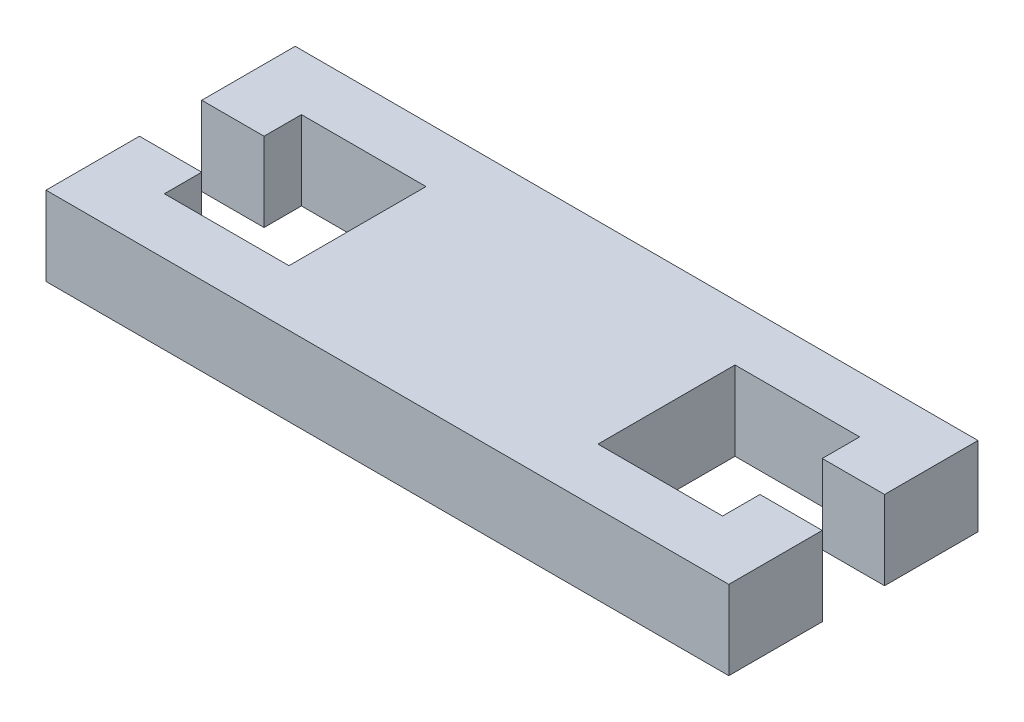
ISO-10303-21;
HEADER;
FILE_DESCRIPTION(('STEP AP214'),'2;1');
FILE_NAME('part.step','',(''),(''),'','','');
FILE_SCHEMA(('AUTOMOTIVE_DESIGN { 1 0 10303 214 1 1 1 1 }'));
ENDSEC;
DATA;
#1=APPLICATION_CONTEXT('core data for automotive mechanical design processes');
#2=APPLICATION_PROTOCOL_DEFINITION('international standard','automotive_design',2000,#1);
#3=PRODUCT_CONTEXT('',#1,'mechanical');
#4=PRODUCT('Part','Part','',(#3));
#5=PRODUCT_RELATED_PRODUCT_CATEGORY('part','',(#4));
#6=PRODUCT_DEFINITION_FORMATION('','',#4);
#7=PRODUCT_DEFINITION_CONTEXT('part definition',#1,'design');
#8=PRODUCT_DEFINITION('design','',#6,#7);
#9=PRODUCT_DEFINITION_SHAPE('','',#8);
#10=(LENGTH_UNIT() NAMED_UNIT(*) SI_UNIT(.MILLI.,.METRE.));
#11=(NAMED_UNIT(*) PLANE_ANGLE_UNIT() SI_UNIT($,.RADIAN.));
#12=(NAMED_UNIT(*) SI_UNIT($,.STERADIAN.) SOLID_ANGLE_UNIT());
#13=UNCERTAINTY_MEASURE_WITH_UNIT(LENGTH_MEASURE(1.E-05),#10,'distance_accuracy_value','');
#14=(GEOMETRIC_REPRESENTATION_CONTEXT(3) GLOBAL_UNCERTAINTY_ASSIGNED_CONTEXT((#13)) GLOBAL_UNIT_ASSIGNED_CONTEXT((#10,
#11,#12)) REPRESENTATION_CONTEXT('',''));
#15=CARTESIAN_POINT('',(0.,0.,0.));
#16=DIRECTION('',(0.,0.,1.));
#17=DIRECTION('',(1.,0.,0.));
#18=AXIS2_PLACEMENT_3D('',#15,#16,#17);
#19=CARTESIAN_POINT('',(0.,6.35,0.));
#20=DIRECTION('',(1.,0.,0.));
#21=DIRECTION('',(0.,0.,-1.));
#22=AXIS2_PLACEMENT_3D('',#19,#20,#21);
#23=PLANE('',#22);
#24=DIRECTION('',(0.,0.,1.));
#25=VECTOR('',#24,1.);
#26=CARTESIAN_POINT('',(0.,0.,0.));
#27=LINE('',#26,#25);
#28=CARTESIAN_POINT('',(0.,0.,-7.5));
#29=VERTEX_POINT('',#28);
#30=CARTESIAN_POINT('',(0.,0.,0.));
#31=VERTEX_POINT('',#30);
#32=EDGE_CURVE('E200',#29,#31,#27,.T.);
#33=ORIENTED_EDGE('',*,*,#32,.T.);
#34=DIRECTION('',(0.,-1.,0.));
#35=VECTOR('',#34,1.);
#36=CARTESIAN_POINT('',(0.,6.35,0.));
#37=LINE('',#36,#35);
#38=CARTESIAN_POINT('',(0.,6.35,0.));
#39=VERTEX_POINT('',#38);
#40=EDGE_CURVE('E11',#39,#31,#37,.T.);
#41=ORIENTED_EDGE('',*,*,#40,.F.);
#42=DIRECTION('',(0.,0.,1.));
#43=VECTOR('',#42,1.);
#44=CARTESIAN_POINT('',(0.,6.35,0.));
#45=LINE('',#44,#43);
#46=CARTESIAN_POINT('',(0.,6.35,-7.5));
#47=VERTEX_POINT('',#46);
#48=EDGE_CURVE('E238',#47,#39,#45,.T.);
#49=ORIENTED_EDGE('',*,*,#48,.F.);
#50=DIRECTION('',(0.,-1.,0.));
#51=VECTOR('',#50,1.);
#52=CARTESIAN_POINT('',(0.,6.35,-7.5));
#53=LINE('',#52,#51);
#54=EDGE_CURVE('E196',#47,#29,#53,.T.);
#55=ORIENTED_EDGE('',*,*,#54,.T.);
#56=EDGE_LOOP('',(#33,#41,#49,#55));
#57=FACE_BOUND('',#56,.T.);
#58=ADVANCED_FACE('F32',(#57),#23,.F.);
#59=CARTESIAN_POINT('',(0.,6.35,0.));
#60=DIRECTION('',(0.,0.,-1.));
#61=DIRECTION('',(-1.,0.,0.));
#62=AXIS2_PLACEMENT_3D('',#59,#60,#61);
#63=PLANE('',#62);
#64=DIRECTION('',(1.,0.,0.));
#65=VECTOR('',#64,1.);
#66=CARTESIAN_POINT('',(0.,0.,0.));
#67=LINE('',#66,#65);
#68=CARTESIAN_POINT('',(54.8,0.,0.));
#69=VERTEX_POINT('',#68);
#70=EDGE_CURVE('E203',#31,#69,#67,.T.);
#71=ORIENTED_EDGE('',*,*,#70,.T.);
#72=DIRECTION('',(0.,-1.,0.));
#73=VECTOR('',#72,1.);
#74=CARTESIAN_POINT('',(54.8,6.35,0.));
#75=LINE('',#74,#73);
#76=CARTESIAN_POINT('',(54.8,6.35,0.));
#77=VERTEX_POINT('',#76);
#78=EDGE_CURVE('E40',#77,#69,#75,.T.);
#79=ORIENTED_EDGE('',*,*,#78,.F.);
#80=DIRECTION('',(1.,0.,0.));
#81=VECTOR('',#80,1.);
#82=CARTESIAN_POINT('',(0.,6.35,0.));
#83=LINE('',#82,#81);
#84=EDGE_CURVE('E127',#39,#77,#83,.T.);
#85=ORIENTED_EDGE('',*,*,#84,.F.);
#86=ORIENTED_EDGE('',*,*,#40,.T.);
#87=EDGE_LOOP('',(#71,#79,#85,#86));
#88=FACE_BOUND('',#87,.T.);
#89=ADVANCED_FACE('F356',(#88),#63,.F.);
#90=CARTESIAN_POINT('',(54.8,6.35,0.));
#91=DIRECTION('',(-1.,0.,0.));
#92=DIRECTION('',(0.,0.,1.));
#93=AXIS2_PLACEMENT_3D('',#90,#91,#92);
#94=PLANE('',#93);
#95=DIRECTION('',(0.,0.,-1.));
#96=VECTOR('',#95,1.);
#97=CARTESIAN_POINT('',(54.8,0.,0.));
#98=LINE('',#97,#96);
#99=CARTESIAN_POINT('',(54.8,0.,-7.5));
#100=VERTEX_POINT('',#99);
#101=EDGE_CURVE('E205',#69,#100,#98,.T.);
#102=ORIENTED_EDGE('',*,*,#101,.T.);
#103=DIRECTION('',(0.,-1.,0.));
#104=VECTOR('',#103,1.);
#105=CARTESIAN_POINT('',(54.8,6.35,-7.5));
#106=LINE('',#105,#104);
#107=CARTESIAN_POINT('',(54.8,6.35,-7.5));
#108=VERTEX_POINT('',#107);
#109=EDGE_CURVE('E281',#108,#100,#106,.T.);
#110=ORIENTED_EDGE('',*,*,#109,.F.);
#111=DIRECTION('',(0.,0.,-1.));
#112=VECTOR('',#111,1.);
#113=CARTESIAN_POINT('',(54.8,6.35,0.));
#114=LINE('',#113,#112);
#115=EDGE_CURVE('E289',#77,#108,#114,.T.);
#116=ORIENTED_EDGE('',*,*,#115,.F.);
#117=ORIENTED_EDGE('',*,*,#78,.T.);
#118=EDGE_LOOP('',(#102,#110,#116,#117));
#119=FACE_BOUND('',#118,.T.);
#120=ADVANCED_FACE('F287',(#119),#94,.F.);
#121=CARTESIAN_POINT('',(54.8,6.35,-7.5));
#122=DIRECTION('',(0.,0.,1.));
#123=DIRECTION('',(1.,0.,0.));
#124=AXIS2_PLACEMENT_3D('',#121,#122,#123);
#125=PLANE('',#124);
#126=DIRECTION('',(-1.,0.,0.));
#127=VECTOR('',#126,1.);
#128=CARTESIAN_POINT('',(54.8,0.,-7.5));
#129=LINE('',#128,#127);
#130=CARTESIAN_POINT('',(49.8,0.,-7.5));
#131=VERTEX_POINT('',#130);
#132=EDGE_CURVE('E207',#100,#131,#129,.T.);
#133=ORIENTED_EDGE('',*,*,#132,.T.);
#134=DIRECTION('',(0.,-1.,0.));
#135=VECTOR('',#134,1.);
#136=CARTESIAN_POINT('',(49.8,6.35,-7.5));
#137=LINE('',#136,#135);
#138=CARTESIAN_POINT('',(49.8,6.35,-7.5));
#139=VERTEX_POINT('',#138);
#140=EDGE_CURVE('E278',#139,#131,#137,.T.);
#141=ORIENTED_EDGE('',*,*,#140,.F.);
#142=DIRECTION('',(-1.,0.,0.));
#143=VECTOR('',#142,1.);
#144=CARTESIAN_POINT('',(54.8,6.35,-7.5));
#145=LINE('',#144,#143);
#146=EDGE_CURVE('E307',#108,#139,#145,.T.);
#147=ORIENTED_EDGE('',*,*,#146,.F.);
#148=ORIENTED_EDGE('',*,*,#109,.T.);
#149=EDGE_LOOP('',(#133,#141,#147,#148));
#150=FACE_BOUND('',#149,.T.);
#151=ADVANCED_FACE('F298',(#150),#125,.F.);
#152=CARTESIAN_POINT('',(49.8,6.35,-4.5));
#153=DIRECTION('',(1.,0.,0.));
#154=DIRECTION('',(0.,0.,-1.));
#155=AXIS2_PLACEMENT_3D('',#152,#153,#154);
#156=PLANE('',#155);
#157=DIRECTION('',(0.,0.,1.));
#158=VECTOR('',#157,1.);
#159=CARTESIAN_POINT('',(49.8,0.,-4.5));
#160=LINE('',#159,#158);
#161=CARTESIAN_POINT('',(49.8,0.,-4.5));
#162=VERTEX_POINT('',#161);
#163=EDGE_CURVE('E209',#131,#162,#160,.T.);
#164=ORIENTED_EDGE('',*,*,#163,.T.);
#165=DIRECTION('',(0.,-1.,0.));
#166=VECTOR('',#165,1.);
#167=CARTESIAN_POINT('',(49.8,6.35,-4.5));
#168=LINE('',#167,#166);
#169=CARTESIAN_POINT('',(49.8,6.35,-4.5));
#170=VERTEX_POINT('',#169);
#171=EDGE_CURVE('E275',#170,#162,#168,.T.);
#172=ORIENTED_EDGE('',*,*,#171,.F.);
#173=DIRECTION('',(0.,0.,1.));
#174=VECTOR('',#173,1.);
#175=CARTESIAN_POINT('',(49.8,6.35,-4.5));
#176=LINE('',#175,#174);
#177=EDGE_CURVE('E304',#139,#170,#176,.T.);
#178=ORIENTED_EDGE('',*,*,#177,.F.);
#179=ORIENTED_EDGE('',*,*,#140,.T.);
#180=EDGE_LOOP('',(#164,#172,#178,#179));
#181=FACE_BOUND('',#180,.T.);
#182=ADVANCED_FACE('F302',(#181),#156,.F.);
#183=CARTESIAN_POINT('',(39.8,6.35,-4.5));
#184=DIRECTION('',(0.,0.,1.));
#185=DIRECTION('',(1.,0.,0.));
#186=AXIS2_PLACEMENT_3D('',#183,#184,#185);
#187=PLANE('',#186);
#188=DIRECTION('',(-1.,0.,0.));
#189=VECTOR('',#188,1.);
#190=CARTESIAN_POINT('',(39.8,0.,-4.5));
#191=LINE('',#190,#189);
#192=CARTESIAN_POINT('',(39.8,0.,-4.5));
#193=VERTEX_POINT('',#192);
#194=EDGE_CURVE('E211',#162,#193,#191,.T.);
#195=ORIENTED_EDGE('',*,*,#194,.T.);
#196=DIRECTION('',(0.,-1.,0.));
#197=VECTOR('',#196,1.);
#198=CARTESIAN_POINT('',(39.8,6.35,-4.5));
#199=LINE('',#198,#197);
#200=CARTESIAN_POINT('',(39.8,6.35,-4.5));
#201=VERTEX_POINT('',#200);
#202=EDGE_CURVE('E272',#201,#193,#199,.T.);
#203=ORIENTED_EDGE('',*,*,#202,.F.);
#204=DIRECTION('',(-1.,0.,0.));
#205=VECTOR('',#204,1.);
#206=CARTESIAN_POINT('',(39.8,6.35,-4.5));
#207=LINE('',#206,#205);
#208=EDGE_CURVE('E306',#170,#201,#207,.T.);
#209=ORIENTED_EDGE('',*,*,#208,.F.);
#210=ORIENTED_EDGE('',*,*,#171,.T.);
#211=EDGE_LOOP('',(#195,#203,#209,#210));
#212=FACE_BOUND('',#211,.T.);
#213=ADVANCED_FACE('F369',(#212),#187,.F.);
#214=CARTESIAN_POINT('',(39.8,6.35,-15.5));
#215=DIRECTION('',(-1.,0.,0.));
#216=DIRECTION('',(0.,0.,1.));
#217=AXIS2_PLACEMENT_3D('',#214,#215,#216);
#218=PLANE('',#217);
#219=DIRECTION('',(0.,0.,-1.));
#220=VECTOR('',#219,1.);
#221=CARTESIAN_POINT('',(39.8,0.,-15.5));
#222=LINE('',#221,#220);
#223=CARTESIAN_POINT('',(39.8,0.,-15.5));
#224=VERTEX_POINT('',#223);
#225=EDGE_CURVE('E213',#193,#224,#222,.T.);
#226=ORIENTED_EDGE('',*,*,#225,.T.);
#227=DIRECTION('',(0.,-1.,0.));
#228=VECTOR('',#227,1.);
#229=CARTESIAN_POINT('',(39.8,6.35,-15.5));
#230=LINE('',#229,#228);
#231=CARTESIAN_POINT('',(39.8,6.35,-15.5));
#232=VERTEX_POINT('',#231);
#233=EDGE_CURVE('E269',#232,#224,#230,.T.);
#234=ORIENTED_EDGE('',*,*,#233,.F.);
#235=DIRECTION('',(0.,0.,-1.));
#236=VECTOR('',#235,1.);
#237=CARTESIAN_POINT('',(39.8,6.35,-15.5));
#238=LINE('',#237,#236);
#239=EDGE_CURVE('E309',#201,#232,#238,.T.);
#240=ORIENTED_EDGE('',*,*,#239,.F.);
#241=ORIENTED_EDGE('',*,*,#202,.T.);
#242=EDGE_LOOP('',(#226,#234,#240,#241));
#243=FACE_BOUND('',#242,.T.);
#244=ADVANCED_FACE('F372',(#243),#218,.F.);
#245=CARTESIAN_POINT('',(49.8,6.35,-15.5));
#246=DIRECTION('',(0.,0.,-1.));
#247=DIRECTION('',(-1.,0.,0.));
#248=AXIS2_PLACEMENT_3D('',#245,#246,#247);
#249=PLANE('',#248);
#250=DIRECTION('',(1.,0.,0.));
#251=VECTOR('',#250,1.);
#252=CARTESIAN_POINT('',(49.8,0.,-15.5));
#253=LINE('',#252,#251);
#254=CARTESIAN_POINT('',(49.8,0.,-15.5));
#255=VERTEX_POINT('',#254);
#256=EDGE_CURVE('E215',#224,#255,#253,.T.);
#257=ORIENTED_EDGE('',*,*,#256,.T.);
#258=DIRECTION('',(0.,-1.,0.));
#259=VECTOR('',#258,1.);
#260=CARTESIAN_POINT('',(49.8,6.35,-15.5));
#261=LINE('',#260,#259);
#262=CARTESIAN_POINT('',(49.8,6.35,-15.5));
#263=VERTEX_POINT('',#262);
#264=EDGE_CURVE('E266',#263,#255,#261,.T.);
#265=ORIENTED_EDGE('',*,*,#264,.F.);
#266=DIRECTION('',(1.,0.,0.));
#267=VECTOR('',#266,1.);
#268=CARTESIAN_POINT('',(49.8,6.35,-15.5));
#269=LINE('',#268,#267);
#270=EDGE_CURVE('E315',#232,#263,#269,.T.);
#271=ORIENTED_EDGE('',*,*,#270,.F.);
#272=ORIENTED_EDGE('',*,*,#233,.T.);
#273=EDGE_LOOP('',(#257,#265,#271,#272));
#274=FACE_BOUND('',#273,.T.);
#275=ADVANCED_FACE('F376',(#274),#249,.F.);
#276=CARTESIAN_POINT('',(49.8,6.35,-15.5));
#277=DIRECTION('',(1.,0.,0.));
#278=DIRECTION('',(0.,0.,-1.));
#279=AXIS2_PLACEMENT_3D('',#276,#277,#278);
#280=PLANE('',#279);
#281=DIRECTION('',(0.,0.,1.));
#282=VECTOR('',#281,1.);
#283=CARTESIAN_POINT('',(49.8,0.,-15.5));
#284=LINE('',#283,#282);
#285=CARTESIAN_POINT('',(49.8,0.,-12.5));
#286=VERTEX_POINT('',#285);
#287=EDGE_CURVE('E217',#255,#286,#284,.T.);
#288=ORIENTED_EDGE('',*,*,#287,.T.);
#289=DIRECTION('',(0.,-1.,0.));
#290=VECTOR('',#289,1.);
#291=CARTESIAN_POINT('',(49.8,6.35,-12.5));
#292=LINE('',#291,#290);
#293=CARTESIAN_POINT('',(49.8,6.35,-12.5));
#294=VERTEX_POINT('',#293);
#295=EDGE_CURVE('E263',#294,#286,#292,.T.);
#296=ORIENTED_EDGE('',*,*,#295,.F.);
#297=DIRECTION('',(0.,0.,1.));
#298=VECTOR('',#297,1.);
#299=CARTESIAN_POINT('',(49.8,6.35,-15.5));
#300=LINE('',#299,#298);
#301=EDGE_CURVE('E317',#263,#294,#300,.T.);
#302=ORIENTED_EDGE('',*,*,#301,.F.);
#303=ORIENTED_EDGE('',*,*,#264,.T.);
#304=EDGE_LOOP('',(#288,#296,#302,#303));
#305=FACE_BOUND('',#304,.T.);
#306=ADVANCED_FACE('F380',(#305),#280,.F.);
#307=CARTESIAN_POINT('',(49.8,6.35,-12.5));
#308=DIRECTION('',(0.,0.,-1.));
#309=DIRECTION('',(-1.,0.,0.));
#310=AXIS2_PLACEMENT_3D('',#307,#308,#309);
#311=PLANE('',#310);
#312=DIRECTION('',(1.,0.,0.));
#313=VECTOR('',#312,1.);
#314=CARTESIAN_POINT('',(49.8,0.,-12.5));
#315=LINE('',#314,#313);
#316=CARTESIAN_POINT('',(54.8,0.,-12.5));
#317=VERTEX_POINT('',#316);
#318=EDGE_CURVE('E219',#286,#317,#315,.T.);
#319=ORIENTED_EDGE('',*,*,#318,.T.);
#320=DIRECTION('',(0.,-1.,0.));
#321=VECTOR('',#320,1.);
#322=CARTESIAN_POINT('',(54.8,6.35,-12.5));
#323=LINE('',#322,#321);
#324=CARTESIAN_POINT('',(54.8,6.35,-12.5));
#325=VERTEX_POINT('',#324);
#326=EDGE_CURVE('E260',#325,#317,#323,.T.);
#327=ORIENTED_EDGE('',*,*,#326,.F.);
#328=DIRECTION('',(1.,0.,0.));
#329=VECTOR('',#328,1.);
#330=CARTESIAN_POINT('',(49.8,6.35,-12.5));
#331=LINE('',#330,#329);
#332=EDGE_CURVE('E319',#294,#325,#331,.T.);
#333=ORIENTED_EDGE('',*,*,#332,.F.);
#334=ORIENTED_EDGE('',*,*,#295,.T.);
#335=EDGE_LOOP('',(#319,#327,#333,#334));
#336=FACE_BOUND('',#335,.T.);
#337=ADVANCED_FACE('F384',(#336),#311,.F.);
#338=CARTESIAN_POINT('',(54.8,6.35,-12.5));
#339=DIRECTION('',(-1.,0.,0.));
#340=DIRECTION('',(0.,0.,1.));
#341=AXIS2_PLACEMENT_3D('',#338,#339,#340);
#342=PLANE('',#341);
#343=DIRECTION('',(0.,0.,-1.));
#344=VECTOR('',#343,1.);
#345=CARTESIAN_POINT('',(54.8,0.,-12.5));
#346=LINE('',#345,#344);
#347=CARTESIAN_POINT('',(54.8,0.,-20.));
#348=VERTEX_POINT('',#347);
#349=EDGE_CURVE('E221',#317,#348,#346,.T.);
#350=ORIENTED_EDGE('',*,*,#349,.T.);
#351=DIRECTION('',(0.,-1.,0.));
#352=VECTOR('',#351,1.);
#353=CARTESIAN_POINT('',(54.8,6.35,-20.));
#354=LINE('',#353,#352);
#355=CARTESIAN_POINT('',(54.8,6.35,-20.));
#356=VERTEX_POINT('',#355);
#357=EDGE_CURVE('E257',#356,#348,#354,.T.);
#358=ORIENTED_EDGE('',*,*,#357,.F.);
#359=DIRECTION('',(0.,0.,-1.));
#360=VECTOR('',#359,1.);
#361=CARTESIAN_POINT('',(54.8,6.35,-12.5));
#362=LINE('',#361,#360);
#363=EDGE_CURVE('E321',#325,#356,#362,.T.);
#364=ORIENTED_EDGE('',*,*,#363,.F.);
#365=ORIENTED_EDGE('',*,*,#326,.T.);
#366=EDGE_LOOP('',(#350,#358,#364,#365));
#367=FACE_BOUND('',#366,.T.);
#368=ADVANCED_FACE('F388',(#367),#342,.F.);
#369=CARTESIAN_POINT('',(0.,6.35,-20.));
#370=DIRECTION('',(0.,0.,1.));
#371=DIRECTION('',(1.,0.,0.));
#372=AXIS2_PLACEMENT_3D('',#369,#370,#371);
#373=PLANE('',#372);
#374=DIRECTION('',(-1.,0.,0.));
#375=VECTOR('',#374,1.);
#376=CARTESIAN_POINT('',(0.,0.,-20.));
#377=LINE('',#376,#375);
#378=CARTESIAN_POINT('',(0.,0.,-20.));
#379=VERTEX_POINT('',#378);
#380=EDGE_CURVE('E223',#348,#379,#377,.T.);
#381=ORIENTED_EDGE('',*,*,#380,.T.);
#382=DIRECTION('',(0.,-1.,0.));
#383=VECTOR('',#382,1.);
#384=CARTESIAN_POINT('',(0.,6.35,-20.));
#385=LINE('',#384,#383);
#386=CARTESIAN_POINT('',(0.,6.35,-20.));
#387=VERTEX_POINT('',#386);
#388=EDGE_CURVE('E254',#387,#379,#385,.T.);
#389=ORIENTED_EDGE('',*,*,#388,.F.);
#390=DIRECTION('',(-1.,0.,0.));
#391=VECTOR('',#390,1.);
#392=CARTESIAN_POINT('',(0.,6.35,-20.));
#393=LINE('',#392,#391);
#394=EDGE_CURVE('E323',#356,#387,#393,.T.);
#395=ORIENTED_EDGE('',*,*,#394,.F.);
#396=ORIENTED_EDGE('',*,*,#357,.T.);
#397=EDGE_LOOP('',(#381,#389,#395,#396));
#398=FACE_BOUND('',#397,.T.);
#399=ADVANCED_FACE('F392',(#398),#373,.F.);
#400=CARTESIAN_POINT('',(0.,6.35,-12.5));
#401=DIRECTION('',(1.,0.,0.));
#402=DIRECTION('',(0.,0.,-1.));
#403=AXIS2_PLACEMENT_3D('',#400,#401,#402);
#404=PLANE('',#403);
#405=DIRECTION('',(0.,0.,1.));
#406=VECTOR('',#405,1.);
#407=CARTESIAN_POINT('',(0.,0.,-12.5));
#408=LINE('',#407,#406);
#409=CARTESIAN_POINT('',(0.,0.,-12.5));
#410=VERTEX_POINT('',#409);
#411=EDGE_CURVE('E225',#379,#410,#408,.T.);
#412=ORIENTED_EDGE('',*,*,#411,.T.);
#413=DIRECTION('',(0.,-1.,0.));
#414=VECTOR('',#413,1.);
#415=CARTESIAN_POINT('',(0.,6.35,-12.5));
#416=LINE('',#415,#414);
#417=CARTESIAN_POINT('',(0.,6.35,-12.5));
#418=VERTEX_POINT('',#417);
#419=EDGE_CURVE('E251',#418,#410,#416,.T.);
#420=ORIENTED_EDGE('',*,*,#419,.F.);
#421=DIRECTION('',(0.,0.,1.));
#422=VECTOR('',#421,1.);
#423=CARTESIAN_POINT('',(0.,6.35,-12.5));
#424=LINE('',#423,#422);
#425=EDGE_CURVE('E325',#387,#418,#424,.T.);
#426=ORIENTED_EDGE('',*,*,#425,.F.);
#427=ORIENTED_EDGE('',*,*,#388,.T.);
#428=EDGE_LOOP('',(#412,#420,#426,#427));
#429=FACE_BOUND('',#428,.T.);
#430=ADVANCED_FACE('F396',(#429),#404,.F.);
#431=CARTESIAN_POINT('',(5.,6.35,-12.5));
#432=DIRECTION('',(0.,0.,-1.));
#433=DIRECTION('',(-1.,0.,0.));
#434=AXIS2_PLACEMENT_3D('',#431,#432,#433);
#435=PLANE('',#434);
#436=DIRECTION('',(1.,0.,0.));
#437=VECTOR('',#436,1.);
#438=CARTESIAN_POINT('',(5.,0.,-12.5));
#439=LINE('',#438,#437);
#440=CARTESIAN_POINT('',(5.,0.,-12.5));
#441=VERTEX_POINT('',#440);
#442=EDGE_CURVE('E227',#410,#441,#439,.T.);
#443=ORIENTED_EDGE('',*,*,#442,.T.);
#444=DIRECTION('',(0.,-1.,0.));
#445=VECTOR('',#444,1.);
#446=CARTESIAN_POINT('',(5.,6.35,-12.5));
#447=LINE('',#446,#445);
#448=CARTESIAN_POINT('',(5.,6.35,-12.5));
#449=VERTEX_POINT('',#448);
#450=EDGE_CURVE('E248',#449,#441,#447,.T.);
#451=ORIENTED_EDGE('',*,*,#450,.F.);
#452=DIRECTION('',(1.,0.,0.));
#453=VECTOR('',#452,1.);
#454=CARTESIAN_POINT('',(5.,6.35,-12.5));
#455=LINE('',#454,#453);
#456=EDGE_CURVE('E327',#418,#449,#455,.T.);
#457=ORIENTED_EDGE('',*,*,#456,.F.);
#458=ORIENTED_EDGE('',*,*,#419,.T.);
#459=EDGE_LOOP('',(#443,#451,#457,#458));
#460=FACE_BOUND('',#459,.T.);
#461=ADVANCED_FACE('F400',(#460),#435,.F.);
#462=CARTESIAN_POINT('',(5.,6.35,-15.5));
#463=DIRECTION('',(-1.,0.,0.));
#464=DIRECTION('',(0.,0.,1.));
#465=AXIS2_PLACEMENT_3D('',#462,#463,#464);
#466=PLANE('',#465);
#467=DIRECTION('',(0.,0.,-1.));
#468=VECTOR('',#467,1.);
#469=CARTESIAN_POINT('',(5.,0.,-15.5));
#470=LINE('',#469,#468);
#471=CARTESIAN_POINT('',(5.,0.,-15.5));
#472=VERTEX_POINT('',#471);
#473=EDGE_CURVE('E229',#441,#472,#470,.T.);
#474=ORIENTED_EDGE('',*,*,#473,.T.);
#475=DIRECTION('',(0.,-1.,0.));
#476=VECTOR('',#475,1.);
#477=CARTESIAN_POINT('',(5.,6.35,-15.5));
#478=LINE('',#477,#476);
#479=CARTESIAN_POINT('',(5.,6.35,-15.5));
#480=VERTEX_POINT('',#479);
#481=EDGE_CURVE('E245',#480,#472,#478,.T.);
#482=ORIENTED_EDGE('',*,*,#481,.F.);
#483=DIRECTION('',(0.,0.,-1.));
#484=VECTOR('',#483,1.);
#485=CARTESIAN_POINT('',(5.,6.35,-15.5));
#486=LINE('',#485,#484);
#487=EDGE_CURVE('E329',#449,#480,#486,.T.);
#488=ORIENTED_EDGE('',*,*,#487,.F.);
#489=ORIENTED_EDGE('',*,*,#450,.T.);
#490=EDGE_LOOP('',(#474,#482,#488,#489));
#491=FACE_BOUND('',#490,.T.);
#492=ADVANCED_FACE('F404',(#491),#466,.F.);
#493=CARTESIAN_POINT('',(5.,6.35,-15.5));
#494=DIRECTION('',(0.,0.,-1.));
#495=DIRECTION('',(-1.,0.,0.));
#496=AXIS2_PLACEMENT_3D('',#493,#494,#495);
#497=PLANE('',#496);
#498=DIRECTION('',(1.,0.,0.));
#499=VECTOR('',#498,1.);
#500=CARTESIAN_POINT('',(5.,0.,-15.5));
#501=LINE('',#500,#499);
#502=CARTESIAN_POINT('',(15.,0.,-15.5));
#503=VERTEX_POINT('',#502);
#504=EDGE_CURVE('E231',#472,#503,#501,.T.);
#505=ORIENTED_EDGE('',*,*,#504,.T.);
#506=DIRECTION('',(0.,-1.,0.));
#507=VECTOR('',#506,1.);
#508=CARTESIAN_POINT('',(15.,6.35,-15.5));
#509=LINE('',#508,#507);
#510=CARTESIAN_POINT('',(15.,6.35,-15.5));
#511=VERTEX_POINT('',#510);
#512=EDGE_CURVE('E242',#511,#503,#509,.T.);
#513=ORIENTED_EDGE('',*,*,#512,.F.);
#514=DIRECTION('',(1.,0.,0.));
#515=VECTOR('',#514,1.);
#516=CARTESIAN_POINT('',(5.,6.35,-15.5));
#517=LINE('',#516,#515);
#518=EDGE_CURVE('E331',#480,#511,#517,.T.);
#519=ORIENTED_EDGE('',*,*,#518,.F.);
#520=ORIENTED_EDGE('',*,*,#481,.T.);
#521=EDGE_LOOP('',(#505,#513,#519,#520));
#522=FACE_BOUND('',#521,.T.);
#523=ADVANCED_FACE('F337',(#522),#497,.F.);
#524=CARTESIAN_POINT('',(15.,6.35,-15.5));
#525=DIRECTION('',(1.,0.,0.));
#526=DIRECTION('',(0.,0.,-1.));
#527=AXIS2_PLACEMENT_3D('',#524,#525,#526);
#528=PLANE('',#527);
#529=DIRECTION('',(0.,0.,1.));
#530=VECTOR('',#529,1.);
#531=CARTESIAN_POINT('',(15.,0.,-15.5));
#532=LINE('',#531,#530);
#533=CARTESIAN_POINT('',(15.,0.,-4.5));
#534=VERTEX_POINT('',#533);
#535=EDGE_CURVE('E233',#503,#534,#532,.T.);
#536=ORIENTED_EDGE('',*,*,#535,.T.);
#537=DIRECTION('',(0.,-1.,0.));
#538=VECTOR('',#537,1.);
#539=CARTESIAN_POINT('',(15.,6.35,-4.5));
#540=LINE('',#539,#538);
#541=CARTESIAN_POINT('',(15.,6.35,-4.5));
#542=VERTEX_POINT('',#541);
#543=EDGE_CURVE('E191',#542,#534,#540,.T.);
#544=ORIENTED_EDGE('',*,*,#543,.F.);
#545=DIRECTION('',(0.,0.,1.));
#546=VECTOR('',#545,1.);
#547=CARTESIAN_POINT('',(15.,6.35,-15.5));
#548=LINE('',#547,#546);
#549=EDGE_CURVE('E182',#511,#542,#548,.T.);
#550=ORIENTED_EDGE('',*,*,#549,.F.);
#551=ORIENTED_EDGE('',*,*,#512,.T.);
#552=EDGE_LOOP('',(#536,#544,#550,#551));
#553=FACE_BOUND('',#552,.T.);
#554=ADVANCED_FACE('F341',(#553),#528,.F.);
#555=CARTESIAN_POINT('',(15.,6.35,-4.5));
#556=DIRECTION('',(0.,0.,1.));
#557=DIRECTION('',(1.,0.,0.));
#558=AXIS2_PLACEMENT_3D('',#555,#556,#557);
#559=PLANE('',#558);
#560=DIRECTION('',(-1.,0.,0.));
#561=VECTOR('',#560,1.);
#562=CARTESIAN_POINT('',(15.,0.,-4.5));
#563=LINE('',#562,#561);
#564=CARTESIAN_POINT('',(5.,0.,-4.5));
#565=VERTEX_POINT('',#564);
#566=EDGE_CURVE('E190',#534,#565,#563,.T.);
#567=ORIENTED_EDGE('',*,*,#566,.T.);
#568=DIRECTION('',(0.,-1.,0.));
#569=VECTOR('',#568,1.);
#570=CARTESIAN_POINT('',(5.,6.35,-4.5));
#571=LINE('',#570,#569);
#572=CARTESIAN_POINT('',(5.,6.35,-4.5));
#573=VERTEX_POINT('',#572);
#574=EDGE_CURVE('E187',#573,#565,#571,.T.);
#575=ORIENTED_EDGE('',*,*,#574,.F.);
#576=DIRECTION('',(-1.,0.,0.));
#577=VECTOR('',#576,1.);
#578=CARTESIAN_POINT('',(15.,6.35,-4.5));
#579=LINE('',#578,#577);
#580=EDGE_CURVE('E176',#542,#573,#579,.T.);
#581=ORIENTED_EDGE('',*,*,#580,.F.);
#582=ORIENTED_EDGE('',*,*,#543,.T.);
#583=EDGE_LOOP('',(#567,#575,#581,#582));
#584=FACE_BOUND('',#583,.T.);
#585=ADVANCED_FACE('F188',(#584),#559,.F.);
#586=CARTESIAN_POINT('',(5.,6.35,-4.5));
#587=DIRECTION('',(-1.,0.,0.));
#588=DIRECTION('',(0.,0.,1.));
#589=AXIS2_PLACEMENT_3D('',#586,#587,#588);
#590=PLANE('',#589);
#591=DIRECTION('',(0.,0.,-1.));
#592=VECTOR('',#591,1.);
#593=CARTESIAN_POINT('',(5.,0.,-4.5));
#594=LINE('',#593,#592);
#595=CARTESIAN_POINT('',(5.,0.,-7.5));
#596=VERTEX_POINT('',#595);
#597=EDGE_CURVE('E113',#565,#596,#594,.T.);
#598=ORIENTED_EDGE('',*,*,#597,.T.);
#599=DIRECTION('',(0.,-1.,0.));
#600=VECTOR('',#599,1.);
#601=CARTESIAN_POINT('',(5.,6.35,-7.5));
#602=LINE('',#601,#600);
#603=CARTESIAN_POINT('',(5.,6.35,-7.5));
#604=VERTEX_POINT('',#603);
#605=EDGE_CURVE('E192',#604,#596,#602,.T.);
#606=ORIENTED_EDGE('',*,*,#605,.F.);
#607=DIRECTION('',(0.,0.,-1.));
#608=VECTOR('',#607,1.);
#609=CARTESIAN_POINT('',(5.,6.35,-4.5));
#610=LINE('',#609,#608);
#611=EDGE_CURVE('E180',#573,#604,#610,.T.);
#612=ORIENTED_EDGE('',*,*,#611,.F.);
#613=ORIENTED_EDGE('',*,*,#574,.T.);
#614=EDGE_LOOP('',(#598,#606,#612,#613));
#615=FACE_BOUND('',#614,.T.);
#616=ADVANCED_FACE('F194',(#615),#590,.F.);
#617=CARTESIAN_POINT('',(0.,6.35,-7.5));
#618=DIRECTION('',(0.,0.,1.));
#619=DIRECTION('',(1.,0.,0.));
#620=AXIS2_PLACEMENT_3D('',#617,#618,#619);
#621=PLANE('',#620);
#622=DIRECTION('',(-1.,0.,0.));
#623=VECTOR('',#622,1.);
#624=CARTESIAN_POINT('',(0.,0.,-7.5));
#625=LINE('',#624,#623);
#626=EDGE_CURVE('E119',#596,#29,#625,.T.);
#627=ORIENTED_EDGE('',*,*,#626,.T.);
#628=ORIENTED_EDGE('',*,*,#54,.F.);
#629=DIRECTION('',(-1.,0.,0.));
#630=VECTOR('',#629,1.);
#631=CARTESIAN_POINT('',(0.,6.35,-7.5));
#632=LINE('',#631,#630);
#633=EDGE_CURVE('E48',#604,#47,#632,.T.);
#634=ORIENTED_EDGE('',*,*,#633,.F.);
#635=ORIENTED_EDGE('',*,*,#605,.T.);
#636=EDGE_LOOP('',(#627,#628,#634,#635));
#637=FACE_BOUND('',#636,.T.);
#638=ADVANCED_FACE('F345',(#637),#621,.F.);
#639=CARTESIAN_POINT('',(0.,6.35,0.));
#640=DIRECTION('',(0.,-1.,0.));
#641=DIRECTION('',(0.,0.,-1.));
#642=AXIS2_PLACEMENT_3D('',#639,#640,#641);
#643=PLANE('',#642);
#644=ORIENTED_EDGE('',*,*,#48,.T.);
#645=ORIENTED_EDGE('',*,*,#84,.T.);
#646=ORIENTED_EDGE('',*,*,#115,.T.);
#647=ORIENTED_EDGE('',*,*,#146,.T.);
#648=ORIENTED_EDGE('',*,*,#177,.T.);
#649=ORIENTED_EDGE('',*,*,#208,.T.);
#650=ORIENTED_EDGE('',*,*,#239,.T.);
#651=ORIENTED_EDGE('',*,*,#270,.T.);
#652=ORIENTED_EDGE('',*,*,#301,.T.);
#653=ORIENTED_EDGE('',*,*,#332,.T.);
#654=ORIENTED_EDGE('',*,*,#363,.T.);
#655=ORIENTED_EDGE('',*,*,#394,.T.);
#656=ORIENTED_EDGE('',*,*,#425,.T.);
#657=ORIENTED_EDGE('',*,*,#456,.T.);
#658=ORIENTED_EDGE('',*,*,#487,.T.);
#659=ORIENTED_EDGE('',*,*,#518,.T.);
#660=ORIENTED_EDGE('',*,*,#549,.T.);
#661=ORIENTED_EDGE('',*,*,#580,.T.);
#662=ORIENTED_EDGE('',*,*,#611,.T.);
#663=ORIENTED_EDGE('',*,*,#633,.T.);
#664=EDGE_LOOP('',(#644,#645,#646,#647,#648,#649,#650,#651,#652,#653,#654,#655,#656,#657,#658,
#659,#660,#661,#662,#663));
#665=FACE_BOUND('',#664,.T.);
#666=ADVANCED_FACE('F178',(#665),#643,.F.);
#667=CARTESIAN_POINT('',(0.,0.,0.));
#668=DIRECTION('',(0.,-1.,0.));
#669=DIRECTION('',(0.,0.,-1.));
#670=AXIS2_PLACEMENT_3D('',#667,#668,#669);
#671=PLANE('',#670);
#672=ORIENTED_EDGE('',*,*,#32,.F.);
#673=ORIENTED_EDGE('',*,*,#626,.F.);
#674=ORIENTED_EDGE('',*,*,#597,.F.);
#675=ORIENTED_EDGE('',*,*,#566,.F.);
#676=ORIENTED_EDGE('',*,*,#535,.F.);
#677=ORIENTED_EDGE('',*,*,#504,.F.);
#678=ORIENTED_EDGE('',*,*,#473,.F.);
#679=ORIENTED_EDGE('',*,*,#442,.F.);
#680=ORIENTED_EDGE('',*,*,#411,.F.);
#681=ORIENTED_EDGE('',*,*,#380,.F.);
#682=ORIENTED_EDGE('',*,*,#349,.F.);
#683=ORIENTED_EDGE('',*,*,#318,.F.);
#684=ORIENTED_EDGE('',*,*,#287,.F.);
#685=ORIENTED_EDGE('',*,*,#256,.F.);
#686=ORIENTED_EDGE('',*,*,#225,.F.);
#687=ORIENTED_EDGE('',*,*,#194,.F.);
#688=ORIENTED_EDGE('',*,*,#163,.F.);
#689=ORIENTED_EDGE('',*,*,#132,.F.);
#690=ORIENTED_EDGE('',*,*,#101,.F.);
#691=ORIENTED_EDGE('',*,*,#70,.F.);
#692=EDGE_LOOP('',(#672,#673,#674,#675,#676,#677,#678,#679,#680,#681,#682,#683,#684,#685,#686,
#687,#688,#689,#690,#691));
#693=FACE_BOUND('',#692,.T.);
#694=ADVANCED_FACE('F293',(#693),#671,.T.);
#695=CLOSED_SHELL('',(#58,#89,#120,#151,#182,#213,#244,#275,#306,#337,#368,#399,#430,#461,#492,
#523,#554,#585,#616,#638,#666,#694));
#696=MANIFOLD_SOLID_BREP('B2',#695);
#697=ADVANCED_BREP_SHAPE_REPRESENTATION('',(#18,#696),#14);
#698=SHAPE_DEFINITION_REPRESENTATION(#9,#697);
ENDSEC;
END-ISO-10303-21;
